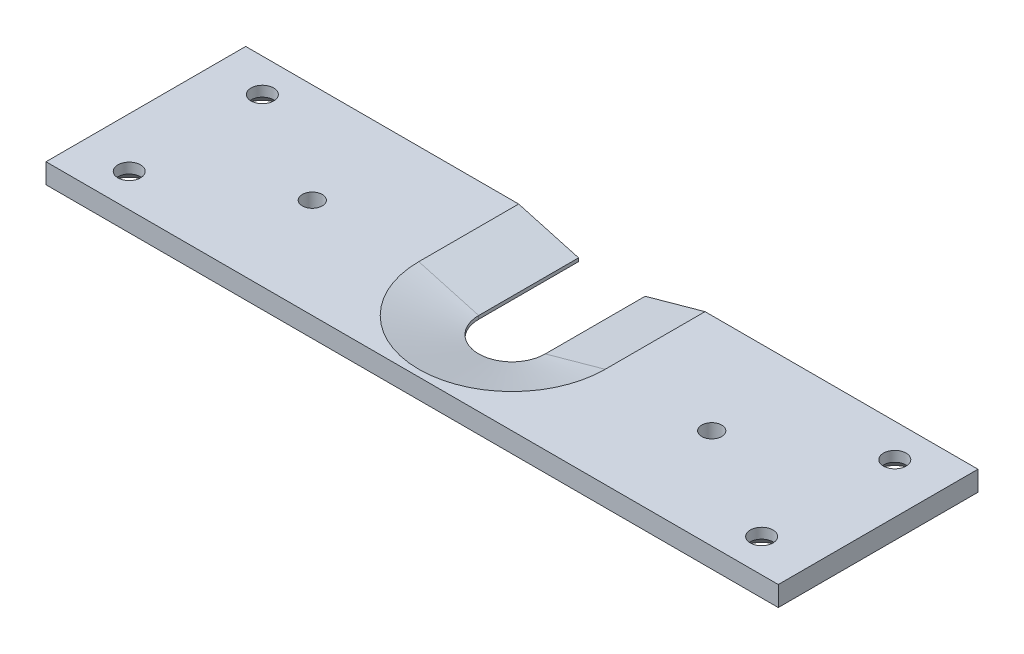
ISO-10303-21;
HEADER;
FILE_DESCRIPTION(('STEP AP214'),'2;1');
FILE_NAME('part.step','',(''),(''),'','','');
FILE_SCHEMA(('AUTOMOTIVE_DESIGN { 1 0 10303 214 1 1 1 1 }'));
ENDSEC;
DATA;
#1=APPLICATION_CONTEXT('core data for automotive mechanical design processes');
#2=APPLICATION_PROTOCOL_DEFINITION('international standard','automotive_design',2000,#1);
#3=PRODUCT_CONTEXT('',#1,'mechanical');
#4=PRODUCT('Part','Part','',(#3));
#5=PRODUCT_RELATED_PRODUCT_CATEGORY('part','',(#4));
#6=PRODUCT_DEFINITION_FORMATION('','',#4);
#7=PRODUCT_DEFINITION_CONTEXT('part definition',#1,'design');
#8=PRODUCT_DEFINITION('design','',#6,#7);
#9=PRODUCT_DEFINITION_SHAPE('','',#8);
#10=(LENGTH_UNIT() NAMED_UNIT(*) SI_UNIT(.MILLI.,.METRE.));
#11=(NAMED_UNIT(*) PLANE_ANGLE_UNIT() SI_UNIT($,.RADIAN.));
#12=(NAMED_UNIT(*) SI_UNIT($,.STERADIAN.) SOLID_ANGLE_UNIT());
#13=UNCERTAINTY_MEASURE_WITH_UNIT(LENGTH_MEASURE(1.E-05),#10,'distance_accuracy_value','');
#14=(GEOMETRIC_REPRESENTATION_CONTEXT(3) GLOBAL_UNCERTAINTY_ASSIGNED_CONTEXT((#13)) GLOBAL_UNIT_ASSIGNED_CONTEXT((#10,
#11,#12)) REPRESENTATION_CONTEXT('',''));
#15=CARTESIAN_POINT('',(0.,0.,0.));
#16=DIRECTION('',(0.,0.,1.));
#17=DIRECTION('',(1.,0.,0.));
#18=AXIS2_PLACEMENT_3D('',#15,#16,#17);
#19=CARTESIAN_POINT('',(-55.,3.,-15.));
#20=DIRECTION('',(0.,0.,1.));
#21=DIRECTION('',(1.,0.,0.));
#22=AXIS2_PLACEMENT_3D('',#19,#20,#21);
#23=PLANE('',#22);
#24=DIRECTION('',(-1.,0.,0.));
#25=VECTOR('',#24,1.);
#26=CARTESIAN_POINT('',(-55.,3.,-15.));
#27=LINE('',#26,#25);
#28=CARTESIAN_POINT('',(-14.0000000000001,3.,-15.));
#29=VERTEX_POINT('',#28);
#30=CARTESIAN_POINT('',(-55.,3.,-15.));
#31=VERTEX_POINT('',#30);
#32=EDGE_CURVE('E175',#29,#31,#27,.T.);
#33=ORIENTED_EDGE('',*,*,#32,.F.);
#34=DIRECTION('',(0.963517909629942,-0.267643863786092,0.));
#35=VECTOR('',#34,1.);
#36=CARTESIAN_POINT('',(-5.,0.500000000000001,-15.));
#37=LINE('',#36,#35);
#38=CARTESIAN_POINT('',(-5.,0.500000000000001,-15.));
#39=VERTEX_POINT('',#38);
#40=EDGE_CURVE('E11',#29,#39,#37,.T.);
#41=ORIENTED_EDGE('',*,*,#40,.T.);
#42=DIRECTION('',(0.,1.,0.));
#43=VECTOR('',#42,1.);
#44=CARTESIAN_POINT('',(-5.,0.,-15.));
#45=LINE('',#44,#43);
#46=CARTESIAN_POINT('',(-5.,0.,-15.));
#47=VERTEX_POINT('',#46);
#48=EDGE_CURVE('E159',#47,#39,#45,.T.);
#49=ORIENTED_EDGE('',*,*,#48,.F.);
#50=DIRECTION('',(-1.,0.,0.));
#51=VECTOR('',#50,1.);
#52=CARTESIAN_POINT('',(-55.,0.,-15.));
#53=LINE('',#52,#51);
#54=CARTESIAN_POINT('',(-55.,0.,-15.));
#55=VERTEX_POINT('',#54);
#56=EDGE_CURVE('E190',#47,#55,#53,.T.);
#57=ORIENTED_EDGE('',*,*,#56,.T.);
#58=DIRECTION('',(0.,-1.,0.));
#59=VECTOR('',#58,1.);
#60=CARTESIAN_POINT('',(-55.,3.,-15.));
#61=LINE('',#60,#59);
#62=EDGE_CURVE('E180',#31,#55,#61,.T.);
#63=ORIENTED_EDGE('',*,*,#62,.F.);
#64=EDGE_LOOP('',(#33,#41,#49,#57,#63));
#65=FACE_BOUND('',#64,.T.);
#66=ADVANCED_FACE('F39',(#65),#23,.F.);
#67=CARTESIAN_POINT('',(-55.,3.,-15.));
#68=DIRECTION('',(1.,0.,0.));
#69=DIRECTION('',(0.,0.,-1.));
#70=AXIS2_PLACEMENT_3D('',#67,#68,#69);
#71=PLANE('',#70);
#72=DIRECTION('',(0.,0.,1.));
#73=VECTOR('',#72,1.);
#74=CARTESIAN_POINT('',(-55.,0.,-15.));
#75=LINE('',#74,#73);
#76=CARTESIAN_POINT('',(-55.,0.,15.));
#77=VERTEX_POINT('',#76);
#78=EDGE_CURVE('E158',#55,#77,#75,.T.);
#79=ORIENTED_EDGE('',*,*,#78,.T.);
#80=DIRECTION('',(0.,-1.,0.));
#81=VECTOR('',#80,1.);
#82=CARTESIAN_POINT('',(-55.,3.,15.));
#83=LINE('',#82,#81);
#84=CARTESIAN_POINT('',(-55.,3.,15.));
#85=VERTEX_POINT('',#84);
#86=EDGE_CURVE('E204',#85,#77,#83,.T.);
#87=ORIENTED_EDGE('',*,*,#86,.F.);
#88=DIRECTION('',(0.,0.,1.));
#89=VECTOR('',#88,1.);
#90=CARTESIAN_POINT('',(-55.,3.,-15.));
#91=LINE('',#90,#89);
#92=EDGE_CURVE('E164',#31,#85,#91,.T.);
#93=ORIENTED_EDGE('',*,*,#92,.F.);
#94=ORIENTED_EDGE('',*,*,#62,.T.);
#95=EDGE_LOOP('',(#79,#87,#93,#94));
#96=FACE_BOUND('',#95,.T.);
#97=ADVANCED_FACE('F331',(#96),#71,.F.);
#98=CARTESIAN_POINT('',(-55.,3.,15.));
#99=DIRECTION('',(0.,0.,-1.));
#100=DIRECTION('',(-1.,0.,0.));
#101=AXIS2_PLACEMENT_3D('',#98,#99,#100);
#102=PLANE('',#101);
#103=DIRECTION('',(1.,0.,0.));
#104=VECTOR('',#103,1.);
#105=CARTESIAN_POINT('',(-55.,0.,15.));
#106=LINE('',#105,#104);
#107=CARTESIAN_POINT('',(55.,0.,15.));
#108=VERTEX_POINT('',#107);
#109=EDGE_CURVE('E184',#77,#108,#106,.T.);
#110=ORIENTED_EDGE('',*,*,#109,.T.);
#111=DIRECTION('',(0.,-1.,0.));
#112=VECTOR('',#111,1.);
#113=CARTESIAN_POINT('',(55.,3.,15.));
#114=LINE('',#113,#112);
#115=CARTESIAN_POINT('',(55.,3.,15.));
#116=VERTEX_POINT('',#115);
#117=EDGE_CURVE('E200',#116,#108,#114,.T.);
#118=ORIENTED_EDGE('',*,*,#117,.F.);
#119=DIRECTION('',(1.,0.,0.));
#120=VECTOR('',#119,1.);
#121=CARTESIAN_POINT('',(-55.,3.,15.));
#122=LINE('',#121,#120);
#123=EDGE_CURVE('E168',#85,#116,#122,.T.);
#124=ORIENTED_EDGE('',*,*,#123,.F.);
#125=ORIENTED_EDGE('',*,*,#86,.T.);
#126=EDGE_LOOP('',(#110,#118,#124,#125));
#127=FACE_BOUND('',#126,.T.);
#128=ADVANCED_FACE('F327',(#127),#102,.F.);
#129=CARTESIAN_POINT('',(55.,3.,-15.));
#130=DIRECTION('',(-1.,0.,0.));
#131=DIRECTION('',(0.,0.,1.));
#132=AXIS2_PLACEMENT_3D('',#129,#130,#131);
#133=PLANE('',#132);
#134=DIRECTION('',(0.,0.,-1.));
#135=VECTOR('',#134,1.);
#136=CARTESIAN_POINT('',(55.,0.,-15.));
#137=LINE('',#136,#135);
#138=CARTESIAN_POINT('',(55.,0.,-15.));
#139=VERTEX_POINT('',#138);
#140=EDGE_CURVE('E187',#108,#139,#137,.T.);
#141=ORIENTED_EDGE('',*,*,#140,.T.);
#142=DIRECTION('',(0.,-1.,0.));
#143=VECTOR('',#142,1.);
#144=CARTESIAN_POINT('',(55.,3.,-15.));
#145=LINE('',#144,#143);
#146=CARTESIAN_POINT('',(55.,3.,-15.));
#147=VERTEX_POINT('',#146);
#148=EDGE_CURVE('E196',#147,#139,#145,.T.);
#149=ORIENTED_EDGE('',*,*,#148,.F.);
#150=DIRECTION('',(0.,0.,-1.));
#151=VECTOR('',#150,1.);
#152=CARTESIAN_POINT('',(55.,3.,-15.));
#153=LINE('',#152,#151);
#154=EDGE_CURVE('E172',#116,#147,#153,.T.);
#155=ORIENTED_EDGE('',*,*,#154,.F.);
#156=ORIENTED_EDGE('',*,*,#117,.T.);
#157=EDGE_LOOP('',(#141,#149,#155,#156));
#158=FACE_BOUND('',#157,.T.);
#159=ADVANCED_FACE('F324',(#158),#133,.F.);
#160=DIRECTION('',(0.,1.,0.));
#161=VECTOR('',#160,1.);
#162=CARTESIAN_POINT('',(5.,0.,-15.));
#163=LINE('',#162,#161);
#164=CARTESIAN_POINT('',(5.,0.,-15.));
#165=VERTEX_POINT('',#164);
#166=CARTESIAN_POINT('',(5.,0.500000000000001,-15.));
#167=VERTEX_POINT('',#166);
#168=EDGE_CURVE('E130',#165,#167,#163,.T.);
#169=ORIENTED_EDGE('',*,*,#168,.T.);
#170=DIRECTION('',(0.963517909629942,0.267643863786091,0.));
#171=VECTOR('',#170,1.);
#172=CARTESIAN_POINT('',(5.,0.500000000000001,-15.));
#173=LINE('',#172,#171);
#174=CARTESIAN_POINT('',(14.0000000000001,3.,-15.));
#175=VERTEX_POINT('',#174);
#176=EDGE_CURVE('E211',#167,#175,#173,.T.);
#177=ORIENTED_EDGE('',*,*,#176,.T.);
#178=EDGE_CURVE('E176',#147,#175,#27,.T.);
#179=ORIENTED_EDGE('',*,*,#178,.F.);
#180=ORIENTED_EDGE('',*,*,#148,.T.);
#181=EDGE_CURVE('E169',#139,#165,#53,.T.);
#182=ORIENTED_EDGE('',*,*,#181,.T.);
#183=EDGE_LOOP('',(#169,#177,#179,#180,#182));
#184=FACE_BOUND('',#183,.T.);
#185=ADVANCED_FACE('F303',(#184),#23,.F.);
#186=CARTESIAN_POINT('',(-55.,3.,15.));
#187=DIRECTION('',(0.,1.,0.));
#188=DIRECTION('',(0.,0.,1.));
#189=AXIS2_PLACEMENT_3D('',#186,#187,#188);
#190=PLANE('',#189);
#191=CARTESIAN_POINT('',(29.9999999999998,3.,0.));
#192=DIRECTION('',(0.,1.,0.));
#193=DIRECTION('',(0.,0.,1.));
#194=AXIS2_PLACEMENT_3D('',#191,#192,#193);
#195=CIRCLE('',#194,1.49999999999999);
#196=CARTESIAN_POINT('',(29.9999999999998,3.,1.49999999999994));
#197=VERTEX_POINT('',#196);
#198=EDGE_CURVE('E293',#197,#197,#195,.T.);
#199=ORIENTED_EDGE('',*,*,#198,.F.);
#200=EDGE_LOOP('',(#199));
#201=FACE_BOUND('',#200,.T.);
#202=CARTESIAN_POINT('',(-30.,3.,0.));
#203=DIRECTION('',(0.,1.,0.));
#204=DIRECTION('',(0.,0.,1.));
#205=AXIS2_PLACEMENT_3D('',#202,#203,#204);
#206=CIRCLE('',#205,1.49999999999999);
#207=CARTESIAN_POINT('',(-30.,3.,1.49999999999999));
#208=VERTEX_POINT('',#207);
#209=EDGE_CURVE('E285',#208,#208,#206,.T.);
#210=ORIENTED_EDGE('',*,*,#209,.F.);
#211=EDGE_LOOP('',(#210));
#212=FACE_BOUND('',#211,.T.);
#213=CARTESIAN_POINT('',(47.5,3.,-10.));
#214=DIRECTION('',(0.,-1.,0.));
#215=DIRECTION('',(0.,0.,-1.));
#216=AXIS2_PLACEMENT_3D('',#213,#214,#215);
#217=CIRCLE('',#216,1.7);
#218=CARTESIAN_POINT('',(47.5,3.,-11.7));
#219=VERTEX_POINT('',#218);
#220=EDGE_CURVE('E277',#219,#219,#217,.T.);
#221=ORIENTED_EDGE('',*,*,#220,.T.);
#222=EDGE_LOOP('',(#221));
#223=FACE_BOUND('',#222,.T.);
#224=CARTESIAN_POINT('',(-47.5,3.,-10.));
#225=DIRECTION('',(0.,-1.,0.));
#226=DIRECTION('',(0.,0.,-1.));
#227=AXIS2_PLACEMENT_3D('',#224,#225,#226);
#228=CIRCLE('',#227,1.7);
#229=CARTESIAN_POINT('',(-47.5,3.,-11.7));
#230=VERTEX_POINT('',#229);
#231=EDGE_CURVE('E265',#230,#230,#228,.T.);
#232=ORIENTED_EDGE('',*,*,#231,.T.);
#233=EDGE_LOOP('',(#232));
#234=FACE_BOUND('',#233,.T.);
#235=CARTESIAN_POINT('',(-47.5,3.,10.));
#236=DIRECTION('',(0.,-1.,0.));
#237=DIRECTION('',(0.,0.,-1.));
#238=AXIS2_PLACEMENT_3D('',#235,#236,#237);
#239=CIRCLE('',#238,1.7);
#240=CARTESIAN_POINT('',(-47.5,3.,8.3));
#241=VERTEX_POINT('',#240);
#242=EDGE_CURVE('E253',#241,#241,#239,.T.);
#243=ORIENTED_EDGE('',*,*,#242,.T.);
#244=EDGE_LOOP('',(#243));
#245=FACE_BOUND('',#244,.T.);
#246=CARTESIAN_POINT('',(47.5,3.,10.));
#247=DIRECTION('',(0.,-1.,0.));
#248=DIRECTION('',(0.,0.,-1.));
#249=AXIS2_PLACEMENT_3D('',#246,#247,#248);
#250=CIRCLE('',#249,1.7);
#251=CARTESIAN_POINT('',(47.5,3.,8.3));
#252=VERTEX_POINT('',#251);
#253=EDGE_CURVE('E238',#252,#252,#250,.T.);
#254=ORIENTED_EDGE('',*,*,#253,.T.);
#255=EDGE_LOOP('',(#254));
#256=FACE_BOUND('',#255,.T.);
#257=ORIENTED_EDGE('',*,*,#178,.T.);
#258=DIRECTION('',(0.,0.,1.));
#259=VECTOR('',#258,1.);
#260=CARTESIAN_POINT('',(14.0000000000001,3.,0.));
#261=LINE('',#260,#259);
#262=CARTESIAN_POINT('',(14.0000000000001,3.,0.));
#263=VERTEX_POINT('',#262);
#264=EDGE_CURVE('E220',#175,#263,#261,.T.);
#265=ORIENTED_EDGE('',*,*,#264,.T.);
#266=CARTESIAN_POINT('',(0.,3.,0.));
#267=DIRECTION('',(0.,1.,0.));
#268=DIRECTION('',(0.,0.,1.));
#269=AXIS2_PLACEMENT_3D('',#266,#267,#268);
#270=CIRCLE('',#269,14.0000000000001);
#271=CARTESIAN_POINT('',(-14.0000000000001,3.,0.));
#272=VERTEX_POINT('',#271);
#273=EDGE_CURVE('E217',#263,#272,#270,.F.);
#274=ORIENTED_EDGE('',*,*,#273,.T.);
#275=DIRECTION('',(0.,0.,-1.));
#276=VECTOR('',#275,1.);
#277=CARTESIAN_POINT('',(-14.0000000000001,3.,-15.));
#278=LINE('',#277,#276);
#279=EDGE_CURVE('E214',#272,#29,#278,.T.);
#280=ORIENTED_EDGE('',*,*,#279,.T.);
#281=ORIENTED_EDGE('',*,*,#32,.T.);
#282=ORIENTED_EDGE('',*,*,#92,.T.);
#283=ORIENTED_EDGE('',*,*,#123,.T.);
#284=ORIENTED_EDGE('',*,*,#154,.T.);
#285=EDGE_LOOP('',(#257,#265,#274,#280,#281,#282,#283,#284));
#286=FACE_BOUND('',#285,.T.);
#287=ADVANCED_FACE('F300',(#201,#212,#223,#234,#245,#256,#286),#190,.T.);
#288=CARTESIAN_POINT('',(-55.,0.,15.));
#289=DIRECTION('',(0.,1.,0.));
#290=DIRECTION('',(0.,0.,1.));
#291=AXIS2_PLACEMENT_3D('',#288,#289,#290);
#292=PLANE('',#291);
#293=CARTESIAN_POINT('',(29.9999999999998,0.,0.));
#294=DIRECTION('',(0.,1.,0.));
#295=DIRECTION('',(0.,0.,1.));
#296=AXIS2_PLACEMENT_3D('',#293,#294,#295);
#297=CIRCLE('',#296,1.5);
#298=CARTESIAN_POINT('',(29.9999999999998,0.,1.49999999999995));
#299=VERTEX_POINT('',#298);
#300=EDGE_CURVE('E289',#299,#299,#297,.T.);
#301=ORIENTED_EDGE('',*,*,#300,.T.);
#302=EDGE_LOOP('',(#301));
#303=FACE_BOUND('',#302,.T.);
#304=CARTESIAN_POINT('',(-30.,0.,0.));
#305=DIRECTION('',(0.,1.,0.));
#306=DIRECTION('',(0.,0.,1.));
#307=AXIS2_PLACEMENT_3D('',#304,#305,#306);
#308=CIRCLE('',#307,1.5);
#309=CARTESIAN_POINT('',(-30.,0.,1.5));
#310=VERTEX_POINT('',#309);
#311=EDGE_CURVE('E281',#310,#310,#308,.T.);
#312=ORIENTED_EDGE('',*,*,#311,.T.);
#313=EDGE_LOOP('',(#312));
#314=FACE_BOUND('',#313,.T.);
#315=CARTESIAN_POINT('',(47.5,0.,-10.));
#316=DIRECTION('',(0.,-1.,0.));
#317=DIRECTION('',(0.,0.,-1.));
#318=AXIS2_PLACEMENT_3D('',#315,#316,#317);
#319=CIRCLE('',#318,3.15);
#320=CARTESIAN_POINT('',(47.5,0.,-13.15));
#321=VERTEX_POINT('',#320);
#322=EDGE_CURVE('E269',#321,#321,#319,.T.);
#323=ORIENTED_EDGE('',*,*,#322,.F.);
#324=EDGE_LOOP('',(#323));
#325=FACE_BOUND('',#324,.T.);
#326=CARTESIAN_POINT('',(-47.5,0.,-10.));
#327=DIRECTION('',(0.,-1.,0.));
#328=DIRECTION('',(0.,0.,-1.));
#329=AXIS2_PLACEMENT_3D('',#326,#327,#328);
#330=CIRCLE('',#329,3.15);
#331=CARTESIAN_POINT('',(-47.5,0.,-13.15));
#332=VERTEX_POINT('',#331);
#333=EDGE_CURVE('E257',#332,#332,#330,.T.);
#334=ORIENTED_EDGE('',*,*,#333,.F.);
#335=EDGE_LOOP('',(#334));
#336=FACE_BOUND('',#335,.T.);
#337=CARTESIAN_POINT('',(-47.5,0.,10.));
#338=DIRECTION('',(0.,-1.,0.));
#339=DIRECTION('',(0.,0.,-1.));
#340=AXIS2_PLACEMENT_3D('',#337,#338,#339);
#341=CIRCLE('',#340,3.15);
#342=CARTESIAN_POINT('',(-47.5,0.,6.85));
#343=VERTEX_POINT('',#342);
#344=EDGE_CURVE('E243',#343,#343,#341,.T.);
#345=ORIENTED_EDGE('',*,*,#344,.F.);
#346=EDGE_LOOP('',(#345));
#347=FACE_BOUND('',#346,.T.);
#348=CARTESIAN_POINT('',(47.5,0.,10.));
#349=DIRECTION('',(0.,-1.,0.));
#350=DIRECTION('',(0.,0.,-1.));
#351=AXIS2_PLACEMENT_3D('',#348,#349,#350);
#352=CIRCLE('',#351,3.15);
#353=CARTESIAN_POINT('',(47.5,0.,6.85));
#354=VERTEX_POINT('',#353);
#355=EDGE_CURVE('E150',#354,#354,#352,.T.);
#356=ORIENTED_EDGE('',*,*,#355,.F.);
#357=EDGE_LOOP('',(#356));
#358=FACE_BOUND('',#357,.T.);
#359=ORIENTED_EDGE('',*,*,#56,.F.);
#360=DIRECTION('',(0.,0.,1.));
#361=VECTOR('',#360,1.);
#362=CARTESIAN_POINT('',(-5.,0.,0.));
#363=LINE('',#362,#361);
#364=CARTESIAN_POINT('',(-5.,0.,0.));
#365=VERTEX_POINT('',#364);
#366=EDGE_CURVE('E131',#47,#365,#363,.T.);
#367=ORIENTED_EDGE('',*,*,#366,.T.);
#368=CARTESIAN_POINT('',(0.,0.,0.));
#369=DIRECTION('',(0.,1.,0.));
#370=DIRECTION('',(0.,0.,1.));
#371=AXIS2_PLACEMENT_3D('',#368,#369,#370);
#372=CIRCLE('',#371,5.);
#373=CARTESIAN_POINT('',(5.,0.,0.));
#374=VERTEX_POINT('',#373);
#375=EDGE_CURVE('E122',#365,#374,#372,.T.);
#376=ORIENTED_EDGE('',*,*,#375,.T.);
#377=DIRECTION('',(0.,0.,-1.));
#378=VECTOR('',#377,1.);
#379=CARTESIAN_POINT('',(5.,0.,0.));
#380=LINE('',#379,#378);
#381=EDGE_CURVE('E134',#374,#165,#380,.T.);
#382=ORIENTED_EDGE('',*,*,#381,.T.);
#383=ORIENTED_EDGE('',*,*,#181,.F.);
#384=ORIENTED_EDGE('',*,*,#140,.F.);
#385=ORIENTED_EDGE('',*,*,#109,.F.);
#386=ORIENTED_EDGE('',*,*,#78,.F.);
#387=EDGE_LOOP('',(#359,#367,#376,#382,#383,#384,#385,#386));
#388=FACE_BOUND('',#387,.T.);
#389=ADVANCED_FACE('F143',(#303,#314,#325,#336,#347,#358,#388),#292,.F.);
#390=CARTESIAN_POINT('',(0.,0.,0.));
#391=DIRECTION('',(0.,1.,0.));
#392=DIRECTION('',(0.,0.,1.));
#393=AXIS2_PLACEMENT_3D('',#390,#391,#392);
#394=CYLINDRICAL_SURFACE('',#393,5.);
#395=DIRECTION('',(0.,1.,0.));
#396=VECTOR('',#395,1.);
#397=CARTESIAN_POINT('',(-5.,0.,0.));
#398=LINE('',#397,#396);
#399=CARTESIAN_POINT('',(-5.,0.500000000000001,0.));
#400=VERTEX_POINT('',#399);
#401=EDGE_CURVE('E155',#365,#400,#398,.T.);
#402=ORIENTED_EDGE('',*,*,#401,.T.);
#403=CARTESIAN_POINT('',(0.,0.500000000000001,0.));
#404=DIRECTION('',(0.,1.,0.));
#405=DIRECTION('',(0.,0.,1.));
#406=AXIS2_PLACEMENT_3D('',#403,#404,#405);
#407=CIRCLE('',#406,5.);
#408=CARTESIAN_POINT('',(5.,0.500000000000001,0.));
#409=VERTEX_POINT('',#408);
#410=EDGE_CURVE('E125',#400,#409,#407,.T.);
#411=ORIENTED_EDGE('',*,*,#410,.T.);
#412=DIRECTION('',(0.,1.,0.));
#413=VECTOR('',#412,1.);
#414=CARTESIAN_POINT('',(5.,0.,0.));
#415=LINE('',#414,#413);
#416=EDGE_CURVE('E118',#374,#409,#415,.T.);
#417=ORIENTED_EDGE('',*,*,#416,.F.);
#418=ORIENTED_EDGE('',*,*,#375,.F.);
#419=EDGE_LOOP('',(#402,#411,#417,#418));
#420=FACE_BOUND('',#419,.T.);
#421=ADVANCED_FACE('F120',(#420),#394,.F.);
#422=CARTESIAN_POINT('',(-5.,0.,0.));
#423=DIRECTION('',(-1.,0.,0.));
#424=DIRECTION('',(0.,0.,1.));
#425=AXIS2_PLACEMENT_3D('',#422,#423,#424);
#426=PLANE('',#425);
#427=ORIENTED_EDGE('',*,*,#48,.T.);
#428=DIRECTION('',(0.,0.,1.));
#429=VECTOR('',#428,1.);
#430=CARTESIAN_POINT('',(-5.,0.500000000000001,0.));
#431=LINE('',#430,#429);
#432=EDGE_CURVE('E49',#39,#400,#431,.T.);
#433=ORIENTED_EDGE('',*,*,#432,.T.);
#434=ORIENTED_EDGE('',*,*,#401,.F.);
#435=ORIENTED_EDGE('',*,*,#366,.F.);
#436=EDGE_LOOP('',(#427,#433,#434,#435));
#437=FACE_BOUND('',#436,.T.);
#438=ADVANCED_FACE('F366',(#437),#426,.F.);
#439=CARTESIAN_POINT('',(5.,0.,0.));
#440=DIRECTION('',(1.,0.,0.));
#441=DIRECTION('',(0.,0.,-1.));
#442=AXIS2_PLACEMENT_3D('',#439,#440,#441);
#443=PLANE('',#442);
#444=ORIENTED_EDGE('',*,*,#416,.T.);
#445=DIRECTION('',(0.,0.,-1.));
#446=VECTOR('',#445,1.);
#447=CARTESIAN_POINT('',(5.,0.500000000000001,-15.));
#448=LINE('',#447,#446);
#449=EDGE_CURVE('E208',#409,#167,#448,.T.);
#450=ORIENTED_EDGE('',*,*,#449,.T.);
#451=ORIENTED_EDGE('',*,*,#168,.F.);
#452=ORIENTED_EDGE('',*,*,#381,.F.);
#453=EDGE_LOOP('',(#444,#450,#451,#452));
#454=FACE_BOUND('',#453,.T.);
#455=ADVANCED_FACE('F135',(#454),#443,.F.);
#456=CARTESIAN_POINT('',(-5.,0.500000000000001,0.));
#457=DIRECTION('',(0.267643863786092,0.963517909629942,0.));
#458=DIRECTION('',(-0.963517909629942,0.267643863786092,0.));
#459=AXIS2_PLACEMENT_3D('',#456,#457,#458);
#460=PLANE('',#459);
#461=ORIENTED_EDGE('',*,*,#40,.F.);
#462=ORIENTED_EDGE('',*,*,#279,.F.);
#463=DIRECTION('',(-0.963517909629942,0.267643863786092,0.));
#464=VECTOR('',#463,1.);
#465=CARTESIAN_POINT('',(-5.,0.500000000000001,0.));
#466=LINE('',#465,#464);
#467=EDGE_CURVE('E43',#400,#272,#466,.T.);
#468=ORIENTED_EDGE('',*,*,#467,.F.);
#469=ORIENTED_EDGE('',*,*,#432,.F.);
#470=EDGE_LOOP('',(#461,#462,#468,#469));
#471=FACE_BOUND('',#470,.T.);
#472=ADVANCED_FACE('F41',(#471),#460,.T.);
#473=CARTESIAN_POINT('',(0.,0.500000000000001,0.));
#474=DIRECTION('',(0.,1.,0.));
#475=DIRECTION('',(0.,0.,1.));
#476=AXIS2_PLACEMENT_3D('',#473,#474,#475);
#477=CONICAL_SURFACE('',#476,5.,1.29984947645648);
#478=ORIENTED_EDGE('',*,*,#467,.T.);
#479=ORIENTED_EDGE('',*,*,#273,.F.);
#480=DIRECTION('',(0.963517909629942,0.267643863786092,0.));
#481=VECTOR('',#480,1.);
#482=CARTESIAN_POINT('',(5.,0.500000000000001,0.));
#483=LINE('',#482,#481);
#484=EDGE_CURVE('E148',#409,#263,#483,.T.);
#485=ORIENTED_EDGE('',*,*,#484,.F.);
#486=ORIENTED_EDGE('',*,*,#410,.F.);
#487=EDGE_LOOP('',(#478,#479,#485,#486));
#488=FACE_BOUND('',#487,.T.);
#489=ADVANCED_FACE('F355',(#488),#477,.F.);
#490=CARTESIAN_POINT('',(5.,0.500000000000001,0.));
#491=DIRECTION('',(-0.267643863786091,0.963517909629942,0.));
#492=DIRECTION('',(-0.963517909629942,-0.267643863786091,0.));
#493=AXIS2_PLACEMENT_3D('',#490,#491,#492);
#494=PLANE('',#493);
#495=ORIENTED_EDGE('',*,*,#484,.T.);
#496=ORIENTED_EDGE('',*,*,#264,.F.);
#497=ORIENTED_EDGE('',*,*,#176,.F.);
#498=ORIENTED_EDGE('',*,*,#449,.F.);
#499=EDGE_LOOP('',(#495,#496,#497,#498));
#500=FACE_BOUND('',#499,.T.);
#501=ADVANCED_FACE('F320',(#500),#494,.T.);
#502=CARTESIAN_POINT('',(47.5,0.,10.));
#503=DIRECTION('',(0.,-1.,0.));
#504=DIRECTION('',(0.,0.,-1.));
#505=AXIS2_PLACEMENT_3D('',#502,#503,#504);
#506=CONICAL_SURFACE('',#505,3.15,0.785398163397449);
#507=CARTESIAN_POINT('',(47.5,1.45,10.));
#508=DIRECTION('',(0.,-1.,0.));
#509=DIRECTION('',(0.,0.,-1.));
#510=AXIS2_PLACEMENT_3D('',#507,#508,#509);
#511=CIRCLE('',#510,1.7);
#512=CARTESIAN_POINT('',(47.5,1.45,8.3));
#513=VERTEX_POINT('',#512);
#514=EDGE_CURVE('E233',#513,#513,#511,.T.);
#515=ORIENTED_EDGE('',*,*,#514,.F.);
#516=EDGE_LOOP('',(#515));
#517=FACE_BOUND('',#516,.T.);
#518=ORIENTED_EDGE('',*,*,#355,.T.);
#519=EDGE_LOOP('',(#518));
#520=FACE_BOUND('',#519,.T.);
#521=ADVANCED_FACE('F354',(#517,#520),#506,.F.);
#522=CARTESIAN_POINT('',(47.5,0.,10.));
#523=DIRECTION('',(0.,-1.,0.));
#524=DIRECTION('',(0.,0.,-1.));
#525=AXIS2_PLACEMENT_3D('',#522,#523,#524);
#526=CYLINDRICAL_SURFACE('',#525,1.7);
#527=ORIENTED_EDGE('',*,*,#253,.F.);
#528=EDGE_LOOP('',(#527));
#529=FACE_BOUND('',#528,.T.);
#530=ORIENTED_EDGE('',*,*,#514,.T.);
#531=EDGE_LOOP('',(#530));
#532=FACE_BOUND('',#531,.T.);
#533=ADVANCED_FACE('F393',(#529,#532),#526,.F.);
#534=CARTESIAN_POINT('',(-47.5,0.,10.));
#535=DIRECTION('',(0.,-1.,0.));
#536=DIRECTION('',(0.,0.,-1.));
#537=AXIS2_PLACEMENT_3D('',#534,#535,#536);
#538=CONICAL_SURFACE('',#537,3.15,0.785398163397449);
#539=CARTESIAN_POINT('',(-47.5,1.45,10.));
#540=DIRECTION('',(0.,-1.,0.));
#541=DIRECTION('',(0.,0.,-1.));
#542=AXIS2_PLACEMENT_3D('',#539,#540,#541);
#543=CIRCLE('',#542,1.7);
#544=CARTESIAN_POINT('',(-47.5,1.45,8.3));
#545=VERTEX_POINT('',#544);
#546=EDGE_CURVE('E249',#545,#545,#543,.T.);
#547=ORIENTED_EDGE('',*,*,#546,.F.);
#548=EDGE_LOOP('',(#547));
#549=FACE_BOUND('',#548,.T.);
#550=ORIENTED_EDGE('',*,*,#344,.T.);
#551=EDGE_LOOP('',(#550));
#552=FACE_BOUND('',#551,.T.);
#553=ADVANCED_FACE('F390',(#549,#552),#538,.F.);
#554=CARTESIAN_POINT('',(-47.5,0.,10.));
#555=DIRECTION('',(0.,-1.,0.));
#556=DIRECTION('',(0.,0.,-1.));
#557=AXIS2_PLACEMENT_3D('',#554,#555,#556);
#558=CYLINDRICAL_SURFACE('',#557,1.7);
#559=ORIENTED_EDGE('',*,*,#242,.F.);
#560=EDGE_LOOP('',(#559));
#561=FACE_BOUND('',#560,.T.);
#562=ORIENTED_EDGE('',*,*,#546,.T.);
#563=EDGE_LOOP('',(#562));
#564=FACE_BOUND('',#563,.T.);
#565=ADVANCED_FACE('F392',(#561,#564),#558,.F.);
#566=CARTESIAN_POINT('',(-47.5,0.,-10.));
#567=DIRECTION('',(0.,-1.,0.));
#568=DIRECTION('',(0.,0.,-1.));
#569=AXIS2_PLACEMENT_3D('',#566,#567,#568);
#570=CONICAL_SURFACE('',#569,3.15,0.785398163397449);
#571=CARTESIAN_POINT('',(-47.5,1.45,-10.));
#572=DIRECTION('',(0.,-1.,0.));
#573=DIRECTION('',(0.,0.,-1.));
#574=AXIS2_PLACEMENT_3D('',#571,#572,#573);
#575=CIRCLE('',#574,1.7);
#576=CARTESIAN_POINT('',(-47.5,1.45,-11.7));
#577=VERTEX_POINT('',#576);
#578=EDGE_CURVE('E261',#577,#577,#575,.T.);
#579=ORIENTED_EDGE('',*,*,#578,.F.);
#580=EDGE_LOOP('',(#579));
#581=FACE_BOUND('',#580,.T.);
#582=ORIENTED_EDGE('',*,*,#333,.T.);
#583=EDGE_LOOP('',(#582));
#584=FACE_BOUND('',#583,.T.);
#585=ADVANCED_FACE('F400',(#581,#584),#570,.F.);
#586=CARTESIAN_POINT('',(-47.5,0.,-10.));
#587=DIRECTION('',(0.,-1.,0.));
#588=DIRECTION('',(0.,0.,-1.));
#589=AXIS2_PLACEMENT_3D('',#586,#587,#588);
#590=CYLINDRICAL_SURFACE('',#589,1.7);
#591=ORIENTED_EDGE('',*,*,#231,.F.);
#592=EDGE_LOOP('',(#591));
#593=FACE_BOUND('',#592,.T.);
#594=ORIENTED_EDGE('',*,*,#578,.T.);
#595=EDGE_LOOP('',(#594));
#596=FACE_BOUND('',#595,.T.);
#597=ADVANCED_FACE('F436',(#593,#596),#590,.F.);
#598=CARTESIAN_POINT('',(47.5,0.,-10.));
#599=DIRECTION('',(0.,-1.,0.));
#600=DIRECTION('',(0.,0.,-1.));
#601=AXIS2_PLACEMENT_3D('',#598,#599,#600);
#602=CONICAL_SURFACE('',#601,3.15,0.785398163397449);
#603=CARTESIAN_POINT('',(47.5,1.45,-10.));
#604=DIRECTION('',(0.,-1.,0.));
#605=DIRECTION('',(0.,0.,-1.));
#606=AXIS2_PLACEMENT_3D('',#603,#604,#605);
#607=CIRCLE('',#606,1.7);
#608=CARTESIAN_POINT('',(47.5,1.45,-11.7));
#609=VERTEX_POINT('',#608);
#610=EDGE_CURVE('E273',#609,#609,#607,.T.);
#611=ORIENTED_EDGE('',*,*,#610,.F.);
#612=EDGE_LOOP('',(#611));
#613=FACE_BOUND('',#612,.T.);
#614=ORIENTED_EDGE('',*,*,#322,.T.);
#615=EDGE_LOOP('',(#614));
#616=FACE_BOUND('',#615,.T.);
#617=ADVANCED_FACE('F445',(#613,#616),#602,.F.);
#618=CARTESIAN_POINT('',(47.5,0.,-10.));
#619=DIRECTION('',(0.,-1.,0.));
#620=DIRECTION('',(0.,0.,-1.));
#621=AXIS2_PLACEMENT_3D('',#618,#619,#620);
#622=CYLINDRICAL_SURFACE('',#621,1.7);
#623=ORIENTED_EDGE('',*,*,#220,.F.);
#624=EDGE_LOOP('',(#623));
#625=FACE_BOUND('',#624,.T.);
#626=ORIENTED_EDGE('',*,*,#610,.T.);
#627=EDGE_LOOP('',(#626));
#628=FACE_BOUND('',#627,.T.);
#629=ADVANCED_FACE('F455',(#625,#628),#622,.F.);
#630=CARTESIAN_POINT('',(-30.,3.,0.));
#631=DIRECTION('',(0.,1.,0.));
#632=DIRECTION('',(0.,0.,1.));
#633=AXIS2_PLACEMENT_3D('',#630,#631,#632);
#634=CYLINDRICAL_SURFACE('',#633,1.49999999999999);
#635=ORIENTED_EDGE('',*,*,#311,.F.);
#636=EDGE_LOOP('',(#635));
#637=FACE_BOUND('',#636,.T.);
#638=ORIENTED_EDGE('',*,*,#209,.T.);
#639=EDGE_LOOP('',(#638));
#640=FACE_BOUND('',#639,.T.);
#641=ADVANCED_FACE('F465',(#637,#640),#634,.F.);
#642=CARTESIAN_POINT('',(29.9999999999998,3.,0.));
#643=DIRECTION('',(0.,1.,0.));
#644=DIRECTION('',(0.,0.,1.));
#645=AXIS2_PLACEMENT_3D('',#642,#643,#644);
#646=CYLINDRICAL_SURFACE('',#645,1.49999999999999);
#647=ORIENTED_EDGE('',*,*,#300,.F.);
#648=EDGE_LOOP('',(#647));
#649=FACE_BOUND('',#648,.T.);
#650=ORIENTED_EDGE('',*,*,#198,.T.);
#651=EDGE_LOOP('',(#650));
#652=FACE_BOUND('',#651,.T.);
#653=ADVANCED_FACE('F298',(#649,#652),#646,.F.);
#654=CLOSED_SHELL('',(#66,#97,#128,#159,#185,#287,#389,#421,#438,#455,#472,#489,#501,#521,#533,
#553,#565,#585,#597,#617,#629,#641,#653));
#655=MANIFOLD_SOLID_BREP('B2',#654);
#656=ADVANCED_BREP_SHAPE_REPRESENTATION('',(#18,#655),#14);
#657=SHAPE_DEFINITION_REPRESENTATION(#9,#656);
ENDSEC;
END-ISO-10303-21;
